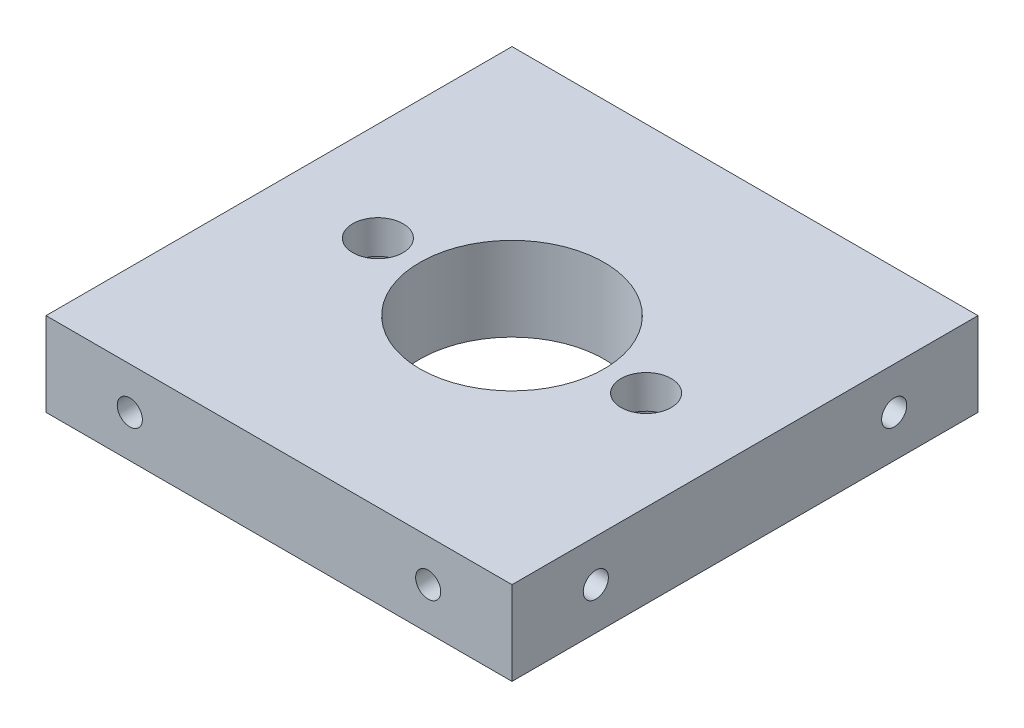
ISO-10303-21;
HEADER;
FILE_DESCRIPTION(('STEP AP214'),'2;1');
FILE_NAME('part.step','',(''),(''),'','','');
FILE_SCHEMA(('AUTOMOTIVE_DESIGN { 1 0 10303 214 1 1 1 1 }'));
ENDSEC;
DATA;
#1=APPLICATION_CONTEXT('core data for automotive mechanical design processes');
#2=APPLICATION_PROTOCOL_DEFINITION('international standard','automotive_design',2000,#1);
#3=PRODUCT_CONTEXT('',#1,'mechanical');
#4=PRODUCT('Part','Part','',(#3));
#5=PRODUCT_RELATED_PRODUCT_CATEGORY('part','',(#4));
#6=PRODUCT_DEFINITION_FORMATION('','',#4);
#7=PRODUCT_DEFINITION_CONTEXT('part definition',#1,'design');
#8=PRODUCT_DEFINITION('design','',#6,#7);
#9=PRODUCT_DEFINITION_SHAPE('','',#8);
#10=(LENGTH_UNIT() NAMED_UNIT(*) SI_UNIT(.MILLI.,.METRE.));
#11=(NAMED_UNIT(*) PLANE_ANGLE_UNIT() SI_UNIT($,.RADIAN.));
#12=(NAMED_UNIT(*) SI_UNIT($,.STERADIAN.) SOLID_ANGLE_UNIT());
#13=UNCERTAINTY_MEASURE_WITH_UNIT(LENGTH_MEASURE(1.E-05),#10,'distance_accuracy_value','');
#14=(GEOMETRIC_REPRESENTATION_CONTEXT(3) GLOBAL_UNCERTAINTY_ASSIGNED_CONTEXT((#13)) GLOBAL_UNIT_ASSIGNED_CONTEXT((#10,
#11,#12)) REPRESENTATION_CONTEXT('',''));
#15=CARTESIAN_POINT('',(0.,0.,0.));
#16=DIRECTION('',(0.,0.,1.));
#17=DIRECTION('',(1.,0.,0.));
#18=AXIS2_PLACEMENT_3D('',#15,#16,#17);
#19=CARTESIAN_POINT('',(21.9,5.,0.));
#20=DIRECTION('',(0.,-1.,0.));
#21=DIRECTION('',(0.,0.,-1.));
#22=AXIS2_PLACEMENT_3D('',#19,#20,#21);
#23=CYLINDRICAL_SURFACE('',#22,1.5);
#24=CARTESIAN_POINT('',(21.9,5.,0.));
#25=DIRECTION('',(0.,1.,0.));
#26=DIRECTION('',(0.,0.,1.));
#27=AXIS2_PLACEMENT_3D('',#24,#25,#26);
#28=CIRCLE('',#27,1.5);
#29=CARTESIAN_POINT('',(21.9,5.,1.5));
#30=VERTEX_POINT('',#29);
#31=EDGE_CURVE('E138',#30,#30,#28,.T.);
#32=ORIENTED_EDGE('',*,*,#31,.T.);
#33=EDGE_LOOP('',(#32));
#34=FACE_BOUND('',#33,.T.);
#35=CARTESIAN_POINT('',(21.9,3.,0.));
#36=DIRECTION('',(0.,-1.,0.));
#37=DIRECTION('',(0.,0.,-1.));
#38=AXIS2_PLACEMENT_3D('',#35,#36,#37);
#39=CIRCLE('',#38,1.5);
#40=CARTESIAN_POINT('',(21.9,3.,-1.5));
#41=VERTEX_POINT('',#40);
#42=EDGE_CURVE('E57',#41,#41,#39,.T.);
#43=ORIENTED_EDGE('',*,*,#42,.T.);
#44=EDGE_LOOP('',(#43));
#45=FACE_BOUND('',#44,.T.);
#46=ADVANCED_FACE('F53',(#34,#45),#23,.F.);
#47=CARTESIAN_POINT('',(5.9,5.,0.));
#48=DIRECTION('',(0.,-1.,0.));
#49=DIRECTION('',(0.,0.,-1.));
#50=AXIS2_PLACEMENT_3D('',#47,#48,#49);
#51=CYLINDRICAL_SURFACE('',#50,1.5);
#52=CARTESIAN_POINT('',(5.9,5.,0.));
#53=DIRECTION('',(0.,1.,0.));
#54=DIRECTION('',(0.,0.,1.));
#55=AXIS2_PLACEMENT_3D('',#52,#53,#54);
#56=CIRCLE('',#55,1.5);
#57=CARTESIAN_POINT('',(5.9,5.,1.5));
#58=VERTEX_POINT('',#57);
#59=EDGE_CURVE('E155',#58,#58,#56,.T.);
#60=ORIENTED_EDGE('',*,*,#59,.T.);
#61=EDGE_LOOP('',(#60));
#62=FACE_BOUND('',#61,.T.);
#63=CARTESIAN_POINT('',(5.9,3.,0.));
#64=DIRECTION('',(0.,-1.,0.));
#65=DIRECTION('',(0.,0.,-1.));
#66=AXIS2_PLACEMENT_3D('',#63,#64,#65);
#67=CIRCLE('',#66,1.5);
#68=CARTESIAN_POINT('',(5.9,3.,-1.5));
#69=VERTEX_POINT('',#68);
#70=EDGE_CURVE('E132',#69,#69,#67,.T.);
#71=ORIENTED_EDGE('',*,*,#70,.T.);
#72=EDGE_LOOP('',(#71));
#73=FACE_BOUND('',#72,.T.);
#74=ADVANCED_FACE('F184',(#62,#73),#51,.F.);
#75=CARTESIAN_POINT('',(0.,5.,0.));
#76=DIRECTION('',(0.,-1.,0.));
#77=DIRECTION('',(0.,0.,-1.));
#78=AXIS2_PLACEMENT_3D('',#75,#76,#77);
#79=PLANE('',#78);
#80=ORIENTED_EDGE('',*,*,#59,.F.);
#81=EDGE_LOOP('',(#80));
#82=FACE_BOUND('',#81,.T.);
#83=ORIENTED_EDGE('',*,*,#31,.F.);
#84=EDGE_LOOP('',(#83));
#85=FACE_BOUND('',#84,.T.);
#86=DIRECTION('',(0.,0.,-1.));
#87=VECTOR('',#86,1.);
#88=CARTESIAN_POINT('',(0.,5.,13.9));
#89=LINE('',#88,#87);
#90=CARTESIAN_POINT('',(0.,5.,13.9));
#91=VERTEX_POINT('',#90);
#92=CARTESIAN_POINT('',(0.,5.,-13.9));
#93=VERTEX_POINT('',#92);
#94=EDGE_CURVE('E117',#91,#93,#89,.T.);
#95=ORIENTED_EDGE('',*,*,#94,.F.);
#96=DIRECTION('',(1.,0.,0.));
#97=VECTOR('',#96,1.);
#98=CARTESIAN_POINT('',(0.,5.,13.9));
#99=LINE('',#98,#97);
#100=CARTESIAN_POINT('',(27.8,5.,13.9));
#101=VERTEX_POINT('',#100);
#102=EDGE_CURVE('E106',#91,#101,#99,.T.);
#103=ORIENTED_EDGE('',*,*,#102,.T.);
#104=DIRECTION('',(0.,0.,-1.));
#105=VECTOR('',#104,1.);
#106=CARTESIAN_POINT('',(27.8,5.,13.9));
#107=LINE('',#106,#105);
#108=CARTESIAN_POINT('',(27.8,5.,-13.9));
#109=VERTEX_POINT('',#108);
#110=EDGE_CURVE('E100',#101,#109,#107,.T.);
#111=ORIENTED_EDGE('',*,*,#110,.T.);
#112=DIRECTION('',(1.,0.,0.));
#113=VECTOR('',#112,1.);
#114=CARTESIAN_POINT('',(0.,5.,-13.9));
#115=LINE('',#114,#113);
#116=EDGE_CURVE('E105',#93,#109,#115,.T.);
#117=ORIENTED_EDGE('',*,*,#116,.F.);
#118=EDGE_LOOP('',(#95,#103,#111,#117));
#119=FACE_BOUND('',#118,.T.);
#120=CARTESIAN_POINT('',(13.9,5.,0.));
#121=DIRECTION('',(0.,1.,0.));
#122=DIRECTION('',(0.,0.,1.));
#123=AXIS2_PLACEMENT_3D('',#120,#121,#122);
#124=CIRCLE('',#123,5.5);
#125=CARTESIAN_POINT('',(13.9,5.,5.5));
#126=VERTEX_POINT('',#125);
#127=EDGE_CURVE('E127',#126,#126,#124,.T.);
#128=ORIENTED_EDGE('',*,*,#127,.F.);
#129=EDGE_LOOP('',(#128));
#130=FACE_BOUND('',#129,.T.);
#131=ADVANCED_FACE('F103',(#82,#85,#119,#130),#79,.F.);
#132=CARTESIAN_POINT('',(0.,0.,0.));
#133=DIRECTION('',(0.,-1.,0.));
#134=DIRECTION('',(0.,0.,-1.));
#135=AXIS2_PLACEMENT_3D('',#132,#133,#134);
#136=PLANE('',#135);
#137=CARTESIAN_POINT('',(21.9,0.,0.));
#138=DIRECTION('',(0.,1.,0.));
#139=DIRECTION('',(0.,0.,1.));
#140=AXIS2_PLACEMENT_3D('',#137,#138,#139);
#141=CIRCLE('',#140,2.25);
#142=CARTESIAN_POINT('',(21.9,0.,2.25));
#143=VERTEX_POINT('',#142);
#144=EDGE_CURVE('E140',#143,#143,#141,.T.);
#145=ORIENTED_EDGE('',*,*,#144,.T.);
#146=EDGE_LOOP('',(#145));
#147=FACE_BOUND('',#146,.T.);
#148=CARTESIAN_POINT('',(5.9,0.,0.));
#149=DIRECTION('',(0.,1.,0.));
#150=DIRECTION('',(0.,0.,1.));
#151=AXIS2_PLACEMENT_3D('',#148,#149,#150);
#152=CIRCLE('',#151,2.25);
#153=CARTESIAN_POINT('',(5.9,0.,2.25));
#154=VERTEX_POINT('',#153);
#155=EDGE_CURVE('E145',#154,#154,#152,.T.);
#156=ORIENTED_EDGE('',*,*,#155,.T.);
#157=EDGE_LOOP('',(#156));
#158=FACE_BOUND('',#157,.T.);
#159=DIRECTION('',(0.,0.,-1.));
#160=VECTOR('',#159,1.);
#161=CARTESIAN_POINT('',(0.,0.,13.9));
#162=LINE('',#161,#160);
#163=CARTESIAN_POINT('',(0.,0.,13.9));
#164=VERTEX_POINT('',#163);
#165=CARTESIAN_POINT('',(0.,0.,-13.9));
#166=VERTEX_POINT('',#165);
#167=EDGE_CURVE('E123',#164,#166,#162,.T.);
#168=ORIENTED_EDGE('',*,*,#167,.T.);
#169=DIRECTION('',(1.,0.,0.));
#170=VECTOR('',#169,1.);
#171=CARTESIAN_POINT('',(0.,0.,-13.9));
#172=LINE('',#171,#170);
#173=CARTESIAN_POINT('',(27.8,0.,-13.9));
#174=VERTEX_POINT('',#173);
#175=EDGE_CURVE('E126',#166,#174,#172,.T.);
#176=ORIENTED_EDGE('',*,*,#175,.T.);
#177=DIRECTION('',(0.,0.,-1.));
#178=VECTOR('',#177,1.);
#179=CARTESIAN_POINT('',(27.8,0.,13.9));
#180=LINE('',#179,#178);
#181=CARTESIAN_POINT('',(27.8,0.,13.9));
#182=VERTEX_POINT('',#181);
#183=EDGE_CURVE('E113',#182,#174,#180,.T.);
#184=ORIENTED_EDGE('',*,*,#183,.F.);
#185=DIRECTION('',(1.,0.,0.));
#186=VECTOR('',#185,1.);
#187=CARTESIAN_POINT('',(0.,0.,13.9));
#188=LINE('',#187,#186);
#189=EDGE_CURVE('E87',#164,#182,#188,.T.);
#190=ORIENTED_EDGE('',*,*,#189,.F.);
#191=EDGE_LOOP('',(#168,#176,#184,#190));
#192=FACE_BOUND('',#191,.T.);
#193=CARTESIAN_POINT('',(13.9,0.,0.));
#194=DIRECTION('',(0.,1.,0.));
#195=DIRECTION('',(0.,0.,1.));
#196=AXIS2_PLACEMENT_3D('',#193,#194,#195);
#197=CIRCLE('',#196,5.5);
#198=CARTESIAN_POINT('',(13.9,0.,5.5));
#199=VERTEX_POINT('',#198);
#200=EDGE_CURVE('E158',#199,#199,#197,.T.);
#201=ORIENTED_EDGE('',*,*,#200,.T.);
#202=EDGE_LOOP('',(#201));
#203=FACE_BOUND('',#202,.T.);
#204=ADVANCED_FACE('F165',(#147,#158,#192,#203),#136,.T.);
#205=CARTESIAN_POINT('',(0.,5.,13.9));
#206=DIRECTION('',(-1.,0.,0.));
#207=DIRECTION('',(0.,0.,1.));
#208=AXIS2_PLACEMENT_3D('',#205,#206,#207);
#209=PLANE('',#208);
#210=CARTESIAN_POINT('',(0.,2.5,-8.9));
#211=DIRECTION('',(-1.,0.,0.));
#212=DIRECTION('',(0.,0.,1.));
#213=AXIS2_PLACEMENT_3D('',#210,#211,#212);
#214=CIRCLE('',#213,0.75);
#215=CARTESIAN_POINT('',(0.,2.5,-8.14999999999999));
#216=VERTEX_POINT('',#215);
#217=EDGE_CURVE('E291',#216,#216,#214,.T.);
#218=ORIENTED_EDGE('',*,*,#217,.F.);
#219=EDGE_LOOP('',(#218));
#220=FACE_BOUND('',#219,.T.);
#221=CARTESIAN_POINT('',(0.,2.5,8.9));
#222=DIRECTION('',(-1.,0.,0.));
#223=DIRECTION('',(0.,0.,1.));
#224=AXIS2_PLACEMENT_3D('',#221,#222,#223);
#225=CIRCLE('',#224,0.75);
#226=CARTESIAN_POINT('',(0.,2.5,9.65));
#227=VERTEX_POINT('',#226);
#228=EDGE_CURVE('E276',#227,#227,#225,.T.);
#229=ORIENTED_EDGE('',*,*,#228,.F.);
#230=EDGE_LOOP('',(#229));
#231=FACE_BOUND('',#230,.T.);
#232=ORIENTED_EDGE('',*,*,#167,.F.);
#233=DIRECTION('',(0.,-1.,0.));
#234=VECTOR('',#233,1.);
#235=CARTESIAN_POINT('',(0.,5.,13.9));
#236=LINE('',#235,#234);
#237=EDGE_CURVE('E13',#91,#164,#236,.T.);
#238=ORIENTED_EDGE('',*,*,#237,.F.);
#239=ORIENTED_EDGE('',*,*,#94,.T.);
#240=DIRECTION('',(0.,-1.,0.));
#241=VECTOR('',#240,1.);
#242=CARTESIAN_POINT('',(0.,5.,-13.9));
#243=LINE('',#242,#241);
#244=EDGE_CURVE('E95',#93,#166,#243,.T.);
#245=ORIENTED_EDGE('',*,*,#244,.T.);
#246=EDGE_LOOP('',(#232,#238,#239,#245));
#247=FACE_BOUND('',#246,.T.);
#248=ADVANCED_FACE('F55',(#220,#231,#247),#209,.T.);
#249=CARTESIAN_POINT('',(0.,5.,13.9));
#250=DIRECTION('',(0.,0.,-1.));
#251=DIRECTION('',(-1.,0.,0.));
#252=AXIS2_PLACEMENT_3D('',#249,#250,#251);
#253=PLANE('',#252);
#254=CARTESIAN_POINT('',(5.00000000000001,2.5,13.9));
#255=DIRECTION('',(0.,0.,-1.));
#256=DIRECTION('',(-1.,0.,0.));
#257=AXIS2_PLACEMENT_3D('',#254,#255,#256);
#258=CIRCLE('',#257,0.75);
#259=CARTESIAN_POINT('',(4.25000000000001,2.5,13.9));
#260=VERTEX_POINT('',#259);
#261=EDGE_CURVE('E300',#260,#260,#258,.T.);
#262=ORIENTED_EDGE('',*,*,#261,.T.);
#263=EDGE_LOOP('',(#262));
#264=FACE_BOUND('',#263,.T.);
#265=CARTESIAN_POINT('',(22.8,2.5,13.9));
#266=DIRECTION('',(0.,0.,-1.));
#267=DIRECTION('',(-1.,0.,0.));
#268=AXIS2_PLACEMENT_3D('',#265,#266,#267);
#269=CIRCLE('',#268,0.750000000000002);
#270=CARTESIAN_POINT('',(22.05,2.5,13.9));
#271=VERTEX_POINT('',#270);
#272=EDGE_CURVE('E303',#271,#271,#269,.T.);
#273=ORIENTED_EDGE('',*,*,#272,.T.);
#274=EDGE_LOOP('',(#273));
#275=FACE_BOUND('',#274,.T.);
#276=ORIENTED_EDGE('',*,*,#189,.T.);
#277=DIRECTION('',(0.,-1.,0.));
#278=VECTOR('',#277,1.);
#279=CARTESIAN_POINT('',(27.8,5.,13.9));
#280=LINE('',#279,#278);
#281=EDGE_CURVE('E63',#101,#182,#280,.T.);
#282=ORIENTED_EDGE('',*,*,#281,.F.);
#283=ORIENTED_EDGE('',*,*,#102,.F.);
#284=ORIENTED_EDGE('',*,*,#237,.T.);
#285=EDGE_LOOP('',(#276,#282,#283,#284));
#286=FACE_BOUND('',#285,.T.);
#287=ADVANCED_FACE('F327',(#264,#275,#286),#253,.F.);
#288=CARTESIAN_POINT('',(27.8,5.,13.9));
#289=DIRECTION('',(-1.,0.,0.));
#290=DIRECTION('',(0.,0.,1.));
#291=AXIS2_PLACEMENT_3D('',#288,#289,#290);
#292=PLANE('',#291);
#293=CARTESIAN_POINT('',(27.8,2.5,-8.9));
#294=DIRECTION('',(-1.,0.,0.));
#295=DIRECTION('',(0.,0.,1.));
#296=AXIS2_PLACEMENT_3D('',#293,#294,#295);
#297=CIRCLE('',#296,0.75);
#298=CARTESIAN_POINT('',(27.8,2.5,-8.15));
#299=VERTEX_POINT('',#298);
#300=EDGE_CURVE('E273',#299,#299,#297,.T.);
#301=ORIENTED_EDGE('',*,*,#300,.T.);
#302=EDGE_LOOP('',(#301));
#303=FACE_BOUND('',#302,.T.);
#304=CARTESIAN_POINT('',(27.8,2.5,8.89999999999999));
#305=DIRECTION('',(-1.,0.,0.));
#306=DIRECTION('',(0.,0.,1.));
#307=AXIS2_PLACEMENT_3D('',#304,#305,#306);
#308=CIRCLE('',#307,0.75);
#309=CARTESIAN_POINT('',(27.8,2.5,9.64999999999999));
#310=VERTEX_POINT('',#309);
#311=EDGE_CURVE('E279',#310,#310,#308,.T.);
#312=ORIENTED_EDGE('',*,*,#311,.T.);
#313=EDGE_LOOP('',(#312));
#314=FACE_BOUND('',#313,.T.);
#315=ORIENTED_EDGE('',*,*,#183,.T.);
#316=DIRECTION('',(0.,-1.,0.));
#317=VECTOR('',#316,1.);
#318=CARTESIAN_POINT('',(27.8,5.,-13.9));
#319=LINE('',#318,#317);
#320=EDGE_CURVE('E110',#109,#174,#319,.T.);
#321=ORIENTED_EDGE('',*,*,#320,.F.);
#322=ORIENTED_EDGE('',*,*,#110,.F.);
#323=ORIENTED_EDGE('',*,*,#281,.T.);
#324=EDGE_LOOP('',(#315,#321,#322,#323));
#325=FACE_BOUND('',#324,.T.);
#326=ADVANCED_FACE('F111',(#303,#314,#325),#292,.F.);
#327=CARTESIAN_POINT('',(0.,5.,-13.9));
#328=DIRECTION('',(0.,0.,-1.));
#329=DIRECTION('',(-1.,0.,0.));
#330=AXIS2_PLACEMENT_3D('',#327,#328,#329);
#331=PLANE('',#330);
#332=CARTESIAN_POINT('',(22.8,2.5,-13.9));
#333=DIRECTION('',(0.,0.,-1.));
#334=DIRECTION('',(-1.,0.,0.));
#335=AXIS2_PLACEMENT_3D('',#332,#333,#334);
#336=CIRCLE('',#335,0.750000000000002);
#337=CARTESIAN_POINT('',(22.05,2.5,-13.9));
#338=VERTEX_POINT('',#337);
#339=EDGE_CURVE('E310',#338,#338,#336,.T.);
#340=ORIENTED_EDGE('',*,*,#339,.F.);
#341=EDGE_LOOP('',(#340));
#342=FACE_BOUND('',#341,.T.);
#343=CARTESIAN_POINT('',(5.,2.5,-13.9));
#344=DIRECTION('',(0.,0.,-1.));
#345=DIRECTION('',(-1.,0.,0.));
#346=AXIS2_PLACEMENT_3D('',#343,#344,#345);
#347=CIRCLE('',#346,0.75);
#348=CARTESIAN_POINT('',(4.25,2.5,-13.9));
#349=VERTEX_POINT('',#348);
#350=EDGE_CURVE('E313',#349,#349,#347,.T.);
#351=ORIENTED_EDGE('',*,*,#350,.F.);
#352=EDGE_LOOP('',(#351));
#353=FACE_BOUND('',#352,.T.);
#354=ORIENTED_EDGE('',*,*,#175,.F.);
#355=ORIENTED_EDGE('',*,*,#244,.F.);
#356=ORIENTED_EDGE('',*,*,#116,.T.);
#357=ORIENTED_EDGE('',*,*,#320,.T.);
#358=EDGE_LOOP('',(#354,#355,#356,#357));
#359=FACE_BOUND('',#358,.T.);
#360=ADVANCED_FACE('F116',(#342,#353,#359),#331,.T.);
#361=CARTESIAN_POINT('',(13.9,5.,0.));
#362=DIRECTION('',(0.,-1.,0.));
#363=DIRECTION('',(0.,0.,-1.));
#364=AXIS2_PLACEMENT_3D('',#361,#362,#363);
#365=CYLINDRICAL_SURFACE('',#364,5.5);
#366=ORIENTED_EDGE('',*,*,#127,.T.);
#367=EDGE_LOOP('',(#366));
#368=FACE_BOUND('',#367,.T.);
#369=ORIENTED_EDGE('',*,*,#200,.F.);
#370=EDGE_LOOP('',(#369));
#371=FACE_BOUND('',#370,.T.);
#372=ADVANCED_FACE('F167',(#368,#371),#365,.F.);
#373=CARTESIAN_POINT('',(5.9,11.3639610306789,0.));
#374=DIRECTION('',(0.,-1.,0.));
#375=DIRECTION('',(0.,0.,-1.));
#376=AXIS2_PLACEMENT_3D('',#373,#374,#375);
#377=CYLINDRICAL_SURFACE('',#376,2.25);
#378=CARTESIAN_POINT('',(5.9,3.,0.));
#379=DIRECTION('',(0.,-1.,0.));
#380=DIRECTION('',(0.,0.,-1.));
#381=AXIS2_PLACEMENT_3D('',#378,#379,#380);
#382=CIRCLE('',#381,2.25);
#383=CARTESIAN_POINT('',(5.9,3.,-2.25));
#384=VERTEX_POINT('',#383);
#385=EDGE_CURVE('E149',#384,#384,#382,.T.);
#386=ORIENTED_EDGE('',*,*,#385,.F.);
#387=EDGE_LOOP('',(#386));
#388=FACE_BOUND('',#387,.T.);
#389=ORIENTED_EDGE('',*,*,#155,.F.);
#390=EDGE_LOOP('',(#389));
#391=FACE_BOUND('',#390,.T.);
#392=ADVANCED_FACE('F169',(#388,#391),#377,.F.);
#393=CARTESIAN_POINT('',(0.,3.,0.));
#394=DIRECTION('',(0.,-1.,0.));
#395=DIRECTION('',(0.,0.,-1.));
#396=AXIS2_PLACEMENT_3D('',#393,#394,#395);
#397=PLANE('',#396);
#398=ORIENTED_EDGE('',*,*,#70,.F.);
#399=EDGE_LOOP('',(#398));
#400=FACE_BOUND('',#399,.T.);
#401=ORIENTED_EDGE('',*,*,#385,.T.);
#402=EDGE_LOOP('',(#401));
#403=FACE_BOUND('',#402,.T.);
#404=ADVANCED_FACE('F176',(#400,#403),#397,.T.);
#405=CARTESIAN_POINT('',(21.9,11.3639610306789,0.));
#406=DIRECTION('',(0.,-1.,0.));
#407=DIRECTION('',(0.,0.,-1.));
#408=AXIS2_PLACEMENT_3D('',#405,#406,#407);
#409=CYLINDRICAL_SURFACE('',#408,2.25);
#410=CARTESIAN_POINT('',(21.9,3.,0.));
#411=DIRECTION('',(0.,-1.,0.));
#412=DIRECTION('',(0.,0.,-1.));
#413=AXIS2_PLACEMENT_3D('',#410,#411,#412);
#414=CIRCLE('',#413,2.25);
#415=CARTESIAN_POINT('',(21.9,3.,-2.25));
#416=VERTEX_POINT('',#415);
#417=EDGE_CURVE('E134',#416,#416,#414,.T.);
#418=ORIENTED_EDGE('',*,*,#417,.F.);
#419=EDGE_LOOP('',(#418));
#420=FACE_BOUND('',#419,.T.);
#421=ORIENTED_EDGE('',*,*,#144,.F.);
#422=EDGE_LOOP('',(#421));
#423=FACE_BOUND('',#422,.T.);
#424=ADVANCED_FACE('F194',(#420,#423),#409,.F.);
#425=CARTESIAN_POINT('',(0.,3.,0.));
#426=DIRECTION('',(0.,-1.,0.));
#427=DIRECTION('',(0.,0.,-1.));
#428=AXIS2_PLACEMENT_3D('',#425,#426,#427);
#429=PLANE('',#428);
#430=ORIENTED_EDGE('',*,*,#42,.F.);
#431=EDGE_LOOP('',(#430));
#432=FACE_BOUND('',#431,.T.);
#433=ORIENTED_EDGE('',*,*,#417,.T.);
#434=EDGE_LOOP('',(#433));
#435=FACE_BOUND('',#434,.T.);
#436=ADVANCED_FACE('F199',(#432,#435),#429,.T.);
#437=CARTESIAN_POINT('',(5.,2.5,-9.9));
#438=DIRECTION('',(0.,0.,-1.));
#439=DIRECTION('',(-1.,0.,0.));
#440=AXIS2_PLACEMENT_3D('',#437,#438,#439);
#441=CYLINDRICAL_SURFACE('',#440,0.75);
#442=CARTESIAN_POINT('',(5.,2.5,-9.9));
#443=DIRECTION('',(0.,0.,-1.));
#444=DIRECTION('',(-1.,0.,0.));
#445=AXIS2_PLACEMENT_3D('',#442,#443,#444);
#446=CIRCLE('',#445,0.75);
#447=CARTESIAN_POINT('',(4.25,2.5,-9.9));
#448=VERTEX_POINT('',#447);
#449=EDGE_CURVE('E299',#448,#448,#446,.T.);
#450=ORIENTED_EDGE('',*,*,#449,.F.);
#451=EDGE_LOOP('',(#450));
#452=FACE_BOUND('',#451,.T.);
#453=ORIENTED_EDGE('',*,*,#350,.T.);
#454=EDGE_LOOP('',(#453));
#455=FACE_BOUND('',#454,.T.);
#456=ADVANCED_FACE('F203',(#452,#455),#441,.F.);
#457=CARTESIAN_POINT('',(5.,2.5,-9.9));
#458=DIRECTION('',(0.,0.,-1.));
#459=DIRECTION('',(-1.,0.,0.));
#460=AXIS2_PLACEMENT_3D('',#457,#458,#459);
#461=PLANE('',#460);
#462=ORIENTED_EDGE('',*,*,#449,.T.);
#463=EDGE_LOOP('',(#462));
#464=FACE_BOUND('',#463,.T.);
#465=ADVANCED_FACE('F205',(#464),#461,.T.);
#466=CARTESIAN_POINT('',(22.8,2.5,-9.9));
#467=DIRECTION('',(0.,0.,-1.));
#468=DIRECTION('',(-1.,0.,0.));
#469=AXIS2_PLACEMENT_3D('',#466,#467,#468);
#470=CYLINDRICAL_SURFACE('',#469,0.750000000000002);
#471=CARTESIAN_POINT('',(22.8,2.5,-9.9));
#472=DIRECTION('',(0.,0.,-1.));
#473=DIRECTION('',(-1.,0.,0.));
#474=AXIS2_PLACEMENT_3D('',#471,#472,#473);
#475=CIRCLE('',#474,0.750000000000002);
#476=CARTESIAN_POINT('',(22.05,2.5,-9.9));
#477=VERTEX_POINT('',#476);
#478=EDGE_CURVE('E152',#477,#477,#475,.T.);
#479=ORIENTED_EDGE('',*,*,#478,.F.);
#480=EDGE_LOOP('',(#479));
#481=FACE_BOUND('',#480,.T.);
#482=ORIENTED_EDGE('',*,*,#339,.T.);
#483=EDGE_LOOP('',(#482));
#484=FACE_BOUND('',#483,.T.);
#485=ADVANCED_FACE('F208',(#481,#484),#470,.F.);
#486=CARTESIAN_POINT('',(22.8,2.5,-9.9));
#487=DIRECTION('',(0.,0.,-1.));
#488=DIRECTION('',(-1.,0.,0.));
#489=AXIS2_PLACEMENT_3D('',#486,#487,#488);
#490=PLANE('',#489);
#491=ORIENTED_EDGE('',*,*,#478,.T.);
#492=EDGE_LOOP('',(#491));
#493=FACE_BOUND('',#492,.T.);
#494=ADVANCED_FACE('F215',(#493),#490,.T.);
#495=CARTESIAN_POINT('',(22.8,2.5,9.9));
#496=DIRECTION('',(0.,0.,1.));
#497=DIRECTION('',(1.,0.,0.));
#498=AXIS2_PLACEMENT_3D('',#495,#496,#497);
#499=CYLINDRICAL_SURFACE('',#498,0.750000000000002);
#500=CARTESIAN_POINT('',(22.8,2.5,9.9));
#501=DIRECTION('',(0.,0.,-1.));
#502=DIRECTION('',(-1.,0.,0.));
#503=AXIS2_PLACEMENT_3D('',#500,#501,#502);
#504=CIRCLE('',#503,0.750000000000002);
#505=CARTESIAN_POINT('',(22.05,2.5,9.9));
#506=VERTEX_POINT('',#505);
#507=EDGE_CURVE('E290',#506,#506,#504,.T.);
#508=ORIENTED_EDGE('',*,*,#507,.T.);
#509=EDGE_LOOP('',(#508));
#510=FACE_BOUND('',#509,.T.);
#511=ORIENTED_EDGE('',*,*,#272,.F.);
#512=EDGE_LOOP('',(#511));
#513=FACE_BOUND('',#512,.T.);
#514=ADVANCED_FACE('F219',(#510,#513),#499,.F.);
#515=CARTESIAN_POINT('',(22.8,2.5,9.9));
#516=DIRECTION('',(0.,0.,-1.));
#517=DIRECTION('',(-1.,0.,0.));
#518=AXIS2_PLACEMENT_3D('',#515,#516,#517);
#519=PLANE('',#518);
#520=ORIENTED_EDGE('',*,*,#507,.F.);
#521=EDGE_LOOP('',(#520));
#522=FACE_BOUND('',#521,.T.);
#523=ADVANCED_FACE('F221',(#522),#519,.F.);
#524=CARTESIAN_POINT('',(5.00000000000001,2.5,9.9));
#525=DIRECTION('',(0.,0.,1.));
#526=DIRECTION('',(1.,0.,0.));
#527=AXIS2_PLACEMENT_3D('',#524,#525,#526);
#528=CYLINDRICAL_SURFACE('',#527,0.75);
#529=CARTESIAN_POINT('',(5.00000000000001,2.5,9.9));
#530=DIRECTION('',(0.,0.,-1.));
#531=DIRECTION('',(-1.,0.,0.));
#532=AXIS2_PLACEMENT_3D('',#529,#530,#531);
#533=CIRCLE('',#532,0.75);
#534=CARTESIAN_POINT('',(4.25000000000001,2.5,9.9));
#535=VERTEX_POINT('',#534);
#536=EDGE_CURVE('E296',#535,#535,#533,.T.);
#537=ORIENTED_EDGE('',*,*,#536,.T.);
#538=EDGE_LOOP('',(#537));
#539=FACE_BOUND('',#538,.T.);
#540=ORIENTED_EDGE('',*,*,#261,.F.);
#541=EDGE_LOOP('',(#540));
#542=FACE_BOUND('',#541,.T.);
#543=ADVANCED_FACE('F224',(#539,#542),#528,.F.);
#544=CARTESIAN_POINT('',(5.00000000000001,2.5,9.9));
#545=DIRECTION('',(0.,0.,-1.));
#546=DIRECTION('',(-1.,0.,0.));
#547=AXIS2_PLACEMENT_3D('',#544,#545,#546);
#548=PLANE('',#547);
#549=ORIENTED_EDGE('',*,*,#536,.F.);
#550=EDGE_LOOP('',(#549));
#551=FACE_BOUND('',#550,.T.);
#552=ADVANCED_FACE('F231',(#551),#548,.F.);
#553=CARTESIAN_POINT('',(4.,2.5,8.9));
#554=DIRECTION('',(-1.,0.,0.));
#555=DIRECTION('',(0.,0.,1.));
#556=AXIS2_PLACEMENT_3D('',#553,#554,#555);
#557=CYLINDRICAL_SURFACE('',#556,0.75);
#558=CARTESIAN_POINT('',(4.,2.5,8.9));
#559=DIRECTION('',(-1.,0.,0.));
#560=DIRECTION('',(0.,0.,1.));
#561=AXIS2_PLACEMENT_3D('',#558,#559,#560);
#562=CIRCLE('',#561,0.75);
#563=CARTESIAN_POINT('',(4.,2.5,9.65));
#564=VERTEX_POINT('',#563);
#565=EDGE_CURVE('E272',#564,#564,#562,.T.);
#566=ORIENTED_EDGE('',*,*,#565,.F.);
#567=EDGE_LOOP('',(#566));
#568=FACE_BOUND('',#567,.T.);
#569=ORIENTED_EDGE('',*,*,#228,.T.);
#570=EDGE_LOOP('',(#569));
#571=FACE_BOUND('',#570,.T.);
#572=ADVANCED_FACE('F235',(#568,#571),#557,.F.);
#573=CARTESIAN_POINT('',(4.,2.5,8.9));
#574=DIRECTION('',(-1.,0.,0.));
#575=DIRECTION('',(0.,0.,1.));
#576=AXIS2_PLACEMENT_3D('',#573,#574,#575);
#577=PLANE('',#576);
#578=ORIENTED_EDGE('',*,*,#565,.T.);
#579=EDGE_LOOP('',(#578));
#580=FACE_BOUND('',#579,.T.);
#581=ADVANCED_FACE('F237',(#580),#577,.T.);
#582=CARTESIAN_POINT('',(4.,2.5,-8.9));
#583=DIRECTION('',(-1.,0.,0.));
#584=DIRECTION('',(0.,0.,1.));
#585=AXIS2_PLACEMENT_3D('',#582,#583,#584);
#586=CYLINDRICAL_SURFACE('',#585,0.75);
#587=CARTESIAN_POINT('',(4.,2.5,-8.9));
#588=DIRECTION('',(-1.,0.,0.));
#589=DIRECTION('',(0.,0.,1.));
#590=AXIS2_PLACEMENT_3D('',#587,#588,#589);
#591=CIRCLE('',#590,0.75);
#592=CARTESIAN_POINT('',(4.,2.5,-8.14999999999999));
#593=VERTEX_POINT('',#592);
#594=EDGE_CURVE('E287',#593,#593,#591,.T.);
#595=ORIENTED_EDGE('',*,*,#594,.F.);
#596=EDGE_LOOP('',(#595));
#597=FACE_BOUND('',#596,.T.);
#598=ORIENTED_EDGE('',*,*,#217,.T.);
#599=EDGE_LOOP('',(#598));
#600=FACE_BOUND('',#599,.T.);
#601=ADVANCED_FACE('F240',(#597,#600),#586,.F.);
#602=CARTESIAN_POINT('',(4.,2.5,-8.9));
#603=DIRECTION('',(-1.,0.,0.));
#604=DIRECTION('',(0.,0.,1.));
#605=AXIS2_PLACEMENT_3D('',#602,#603,#604);
#606=PLANE('',#605);
#607=ORIENTED_EDGE('',*,*,#594,.T.);
#608=EDGE_LOOP('',(#607));
#609=FACE_BOUND('',#608,.T.);
#610=ADVANCED_FACE('F247',(#609),#606,.T.);
#611=CARTESIAN_POINT('',(23.8,2.5,8.89999999999999));
#612=DIRECTION('',(1.,0.,0.));
#613=DIRECTION('',(0.,0.,-1.));
#614=AXIS2_PLACEMENT_3D('',#611,#612,#613);
#615=CYLINDRICAL_SURFACE('',#614,0.75);
#616=CARTESIAN_POINT('',(23.8,2.5,8.89999999999999));
#617=DIRECTION('',(-1.,0.,0.));
#618=DIRECTION('',(0.,0.,1.));
#619=AXIS2_PLACEMENT_3D('',#616,#617,#618);
#620=CIRCLE('',#619,0.75);
#621=CARTESIAN_POINT('',(23.8,2.5,9.64999999999999));
#622=VERTEX_POINT('',#621);
#623=EDGE_CURVE('E284',#622,#622,#620,.T.);
#624=ORIENTED_EDGE('',*,*,#623,.T.);
#625=EDGE_LOOP('',(#624));
#626=FACE_BOUND('',#625,.T.);
#627=ORIENTED_EDGE('',*,*,#311,.F.);
#628=EDGE_LOOP('',(#627));
#629=FACE_BOUND('',#628,.T.);
#630=ADVANCED_FACE('F251',(#626,#629),#615,.F.);
#631=CARTESIAN_POINT('',(23.8,2.5,8.89999999999999));
#632=DIRECTION('',(-1.,0.,0.));
#633=DIRECTION('',(0.,0.,1.));
#634=AXIS2_PLACEMENT_3D('',#631,#632,#633);
#635=PLANE('',#634);
#636=ORIENTED_EDGE('',*,*,#623,.F.);
#637=EDGE_LOOP('',(#636));
#638=FACE_BOUND('',#637,.T.);
#639=ADVANCED_FACE('F253',(#638),#635,.F.);
#640=CARTESIAN_POINT('',(23.8,2.5,-8.9));
#641=DIRECTION('',(1.,0.,0.));
#642=DIRECTION('',(0.,0.,-1.));
#643=AXIS2_PLACEMENT_3D('',#640,#641,#642);
#644=CYLINDRICAL_SURFACE('',#643,0.75);
#645=CARTESIAN_POINT('',(23.8,2.5,-8.9));
#646=DIRECTION('',(-1.,0.,0.));
#647=DIRECTION('',(0.,0.,1.));
#648=AXIS2_PLACEMENT_3D('',#645,#646,#647);
#649=CIRCLE('',#648,0.75);
#650=CARTESIAN_POINT('',(23.8,2.5,-8.15));
#651=VERTEX_POINT('',#650);
#652=EDGE_CURVE('E271',#651,#651,#649,.T.);
#653=ORIENTED_EDGE('',*,*,#652,.T.);
#654=EDGE_LOOP('',(#653));
#655=FACE_BOUND('',#654,.T.);
#656=ORIENTED_EDGE('',*,*,#300,.F.);
#657=EDGE_LOOP('',(#656));
#658=FACE_BOUND('',#657,.T.);
#659=ADVANCED_FACE('F256',(#655,#658),#644,.F.);
#660=CARTESIAN_POINT('',(23.8,2.5,-8.9));
#661=DIRECTION('',(-1.,0.,0.));
#662=DIRECTION('',(0.,0.,1.));
#663=AXIS2_PLACEMENT_3D('',#660,#661,#662);
#664=PLANE('',#663);
#665=ORIENTED_EDGE('',*,*,#652,.F.);
#666=EDGE_LOOP('',(#665));
#667=FACE_BOUND('',#666,.T.);
#668=ADVANCED_FACE('F263',(#667),#664,.F.);
#669=CLOSED_SHELL('',(#46,#74,#131,#204,#248,#287,#326,#360,#372,#392,#404,#424,#436,#456,#465,
#485,#494,#514,#523,#543,#552,#572,#581,#601,#610,#630,#639,#659,#668));
#670=MANIFOLD_SOLID_BREP('B2',#669);
#671=ADVANCED_BREP_SHAPE_REPRESENTATION('',(#18,#670),#14);
#672=SHAPE_DEFINITION_REPRESENTATION(#9,#671);
ENDSEC;
END-ISO-10303-21;
